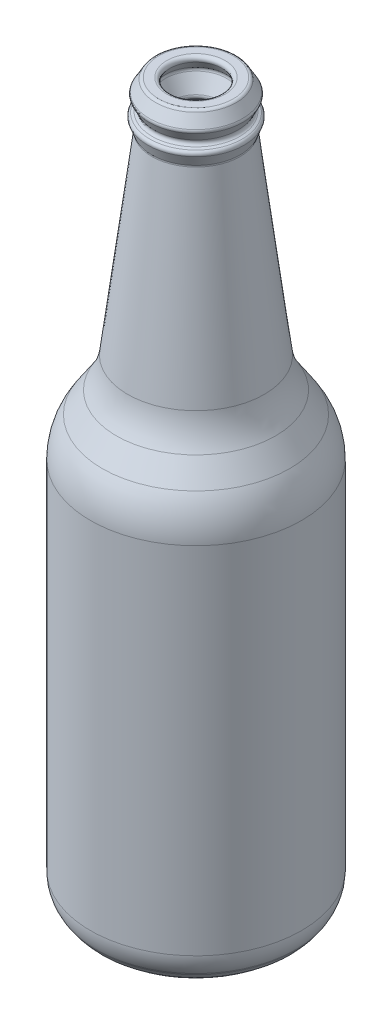
ISO-10303-21;
HEADER;
FILE_DESCRIPTION(('STEP AP214'),'2;1');
FILE_NAME('part.step','',(''),(''),'','','');
FILE_SCHEMA(('AUTOMOTIVE_DESIGN { 1 0 10303 214 1 1 1 1 }'));
ENDSEC;
DATA;
#1=APPLICATION_CONTEXT('core data for automotive mechanical design processes');
#2=APPLICATION_PROTOCOL_DEFINITION('international standard','automotive_design',2000,#1);
#3=PRODUCT_CONTEXT('',#1,'mechanical');
#4=PRODUCT('Part','Part','',(#3));
#5=PRODUCT_RELATED_PRODUCT_CATEGORY('part','',(#4));
#6=PRODUCT_DEFINITION_FORMATION('','',#4);
#7=PRODUCT_DEFINITION_CONTEXT('part definition',#1,'design');
#8=PRODUCT_DEFINITION('design','',#6,#7);
#9=PRODUCT_DEFINITION_SHAPE('','',#8);
#10=(LENGTH_UNIT() NAMED_UNIT(*) SI_UNIT(.MILLI.,.METRE.));
#11=(NAMED_UNIT(*) PLANE_ANGLE_UNIT() SI_UNIT($,.RADIAN.));
#12=(NAMED_UNIT(*) SI_UNIT($,.STERADIAN.) SOLID_ANGLE_UNIT());
#13=UNCERTAINTY_MEASURE_WITH_UNIT(LENGTH_MEASURE(1.E-05),#10,'distance_accuracy_value','');
#14=(GEOMETRIC_REPRESENTATION_CONTEXT(3) GLOBAL_UNCERTAINTY_ASSIGNED_CONTEXT((#13)) GLOBAL_UNIT_ASSIGNED_CONTEXT((#10,
#11,#12)) REPRESENTATION_CONTEXT('',''));
#15=CARTESIAN_POINT('',(0.,0.,0.));
#16=DIRECTION('',(0.,0.,1.));
#17=DIRECTION('',(1.,0.,0.));
#18=AXIS2_PLACEMENT_3D('',#15,#16,#17);
#19=CARTESIAN_POINT('',(0.,127.791737032349,0.));
#20=DIRECTION('',(0.,-1.,0.));
#21=DIRECTION('',(1.,0.,0.));
#22=AXIS2_PLACEMENT_3D('',#19,#20,#21);
#23=PLANE('',#22);
#24=CARTESIAN_POINT('',(0.,127.791737032349,0.));
#25=DIRECTION('',(0.,-1.,0.));
#26=DIRECTION('',(1.,0.,0.));
#27=AXIS2_PLACEMENT_3D('',#24,#25,#26);
#28=CIRCLE('',#27,8.2793986318879);
#29=CARTESIAN_POINT('',(8.2793986318879,127.791737032349,0.));
#30=VERTEX_POINT('',#29);
#31=EDGE_CURVE('E10',#30,#30,#28,.T.);
#32=ORIENTED_EDGE('',*,*,#31,.T.);
#33=EDGE_LOOP('',(#32));
#34=FACE_BOUND('',#33,.T.);
#35=CARTESIAN_POINT('',(0.,127.791737032349,0.));
#36=DIRECTION('',(0.,-1.,0.));
#37=DIRECTION('',(1.,0.,0.));
#38=AXIS2_PLACEMENT_3D('',#35,#36,#37);
#39=CIRCLE('',#38,10.5942455296789);
#40=CARTESIAN_POINT('',(10.5942455296789,127.791737032349,0.));
#41=VERTEX_POINT('',#40);
#42=EDGE_CURVE('E58',#41,#41,#39,.F.);
#43=ORIENTED_EDGE('',*,*,#42,.T.);
#44=EDGE_LOOP('',(#43));
#45=FACE_BOUND('',#44,.T.);
#46=ADVANCED_FACE('F32',(#34,#45),#23,.F.);
#47=CARTESIAN_POINT('',(0.,123.791737032349,0.));
#48=DIRECTION('',(0.,-1.,0.));
#49=DIRECTION('',(1.,0.,0.));
#50=AXIS2_PLACEMENT_3D('',#47,#48,#49);
#51=CONICAL_SURFACE('',#50,13.5,0.527659265166952);
#52=CARTESIAN_POINT('',(0.,124.266053201565,0.));
#53=DIRECTION('',(0.,1.,0.));
#54=DIRECTION('',(-1.,0.,0.));
#55=AXIS2_PLACEMENT_3D('',#52,#53,#54);
#56=CIRCLE('',#55,13.2235794424648);
#57=CARTESIAN_POINT('',(-13.2235794424648,124.266053201565,0.));
#58=VERTEX_POINT('',#57);
#59=EDGE_CURVE('E61',#58,#58,#56,.T.);
#60=ORIENTED_EDGE('',*,*,#59,.T.);
#61=EDGE_LOOP('',(#60));
#62=FACE_BOUND('',#61,.T.);
#63=CARTESIAN_POINT('',(0.,127.295249387916,0.));
#64=DIRECTION('',(0.,1.,0.));
#65=DIRECTION('',(-1.,0.,0.));
#66=AXIS2_PLACEMENT_3D('',#63,#64,#65);
#67=CIRCLE('',#66,11.4582335549382);
#68=CARTESIAN_POINT('',(-11.4582335549382,127.295249387916,0.));
#69=VERTEX_POINT('',#68);
#70=EDGE_CURVE('E64',#69,#69,#67,.F.);
#71=ORIENTED_EDGE('',*,*,#70,.T.);
#72=EDGE_LOOP('',(#71));
#73=FACE_BOUND('',#72,.T.);
#74=ADVANCED_FACE('F149',(#62,#73),#51,.T.);
#75=CARTESIAN_POINT('',(0.,119.916737032349,0.));
#76=DIRECTION('',(0.,1.,0.));
#77=DIRECTION('',(-1.,0.,0.));
#78=AXIS2_PLACEMENT_3D('',#75,#76,#77);
#79=CONICAL_SURFACE('',#78,11.5,0.476467419473708);
#80=CARTESIAN_POINT('',(0.,120.854324107116,0.));
#81=DIRECTION('',(0.,1.,0.));
#82=DIRECTION('',(-1.,0.,0.));
#83=AXIS2_PLACEMENT_3D('',#80,#81,#82);
#84=CIRCLE('',#83,11.9839159095576);
#85=CARTESIAN_POINT('',(-11.9839159095576,120.854324107116,0.));
#86=VERTEX_POINT('',#85);
#87=EDGE_CURVE('E67',#86,#86,#84,.T.);
#88=ORIENTED_EDGE('',*,*,#87,.T.);
#89=EDGE_LOOP('',(#88));
#90=FACE_BOUND('',#89,.T.);
#91=CARTESIAN_POINT('',(0.,123.303897926228,0.));
#92=DIRECTION('',(0.,-1.,0.));
#93=DIRECTION('',(1.,0.,0.));
#94=AXIS2_PLACEMENT_3D('',#91,#92,#93);
#95=CIRCLE('',#94,13.2482120742605);
#96=CARTESIAN_POINT('',(13.2482120742605,123.303897926228,0.));
#97=VERTEX_POINT('',#96);
#98=EDGE_CURVE('E70',#97,#97,#95,.T.);
#99=ORIENTED_EDGE('',*,*,#98,.T.);
#100=EDGE_LOOP('',(#99));
#101=FACE_BOUND('',#100,.T.);
#102=ADVANCED_FACE('F154',(#90,#101),#79,.T.);
#103=CARTESIAN_POINT('',(0.,118.791737032349,0.));
#104=DIRECTION('',(0.,-1.,0.));
#105=DIRECTION('',(1.,0.,0.));
#106=AXIS2_PLACEMENT_3D('',#103,#104,#105);
#107=CONICAL_SURFACE('',#106,14.,1.14794240066196);
#108=CARTESIAN_POINT('',(0.,119.176612206573,0.));
#109=DIRECTION('',(0.,1.,0.));
#110=DIRECTION('',(-1.,0.,0.));
#111=AXIS2_PLACEMENT_3D('',#108,#109,#110);
#112=CIRCLE('',#111,13.1447218350575);
#113=CARTESIAN_POINT('',(-13.1447218350575,119.176612206573,0.));
#114=VERTEX_POINT('',#113);
#115=EDGE_CURVE('E73',#114,#114,#112,.T.);
#116=ORIENTED_EDGE('',*,*,#115,.T.);
#117=EDGE_LOOP('',(#116));
#118=FACE_BOUND('',#117,.T.);
#119=CARTESIAN_POINT('',(0.,119.483759682171,0.));
#120=DIRECTION('',(0.,-1.,0.));
#121=DIRECTION('',(1.,0.,0.));
#122=AXIS2_PLACEMENT_3D('',#119,#120,#121);
#123=CIRCLE('',#122,12.4621718892836);
#124=CARTESIAN_POINT('',(12.4621718892836,119.483759682171,0.));
#125=VERTEX_POINT('',#124);
#126=EDGE_CURVE('E76',#125,#125,#123,.T.);
#127=ORIENTED_EDGE('',*,*,#126,.T.);
#128=EDGE_LOOP('',(#127));
#129=FACE_BOUND('',#128,.T.);
#130=ADVANCED_FACE('F247',(#118,#129),#107,.T.);
#131=CARTESIAN_POINT('',(0.,114.791737032349,0.));
#132=DIRECTION('',(0.,1.,0.));
#133=DIRECTION('',(-1.,0.,0.));
#134=AXIS2_PLACEMENT_3D('',#131,#132,#133);
#135=CONICAL_SURFACE('',#134,12.5,0.358770670270572);
#136=CARTESIAN_POINT('',(0.,115.022423974682,0.));
#137=DIRECTION('',(0.,1.,0.));
#138=DIRECTION('',(-1.,0.,0.));
#139=AXIS2_PLACEMENT_3D('',#136,#137,#138);
#140=CIRCLE('',#139,12.5865076033751);
#141=CARTESIAN_POINT('',(-12.5865076033751,115.022423974682,0.));
#142=VERTEX_POINT('',#141);
#143=EDGE_CURVE('E82',#142,#142,#140,.T.);
#144=ORIENTED_EDGE('',*,*,#143,.T.);
#145=EDGE_LOOP('',(#144));
#146=FACE_BOUND('',#145,.T.);
#147=CARTESIAN_POINT('',(0.,117.913567259809,0.));
#148=DIRECTION('',(0.,-1.,0.));
#149=DIRECTION('',(1.,0.,0.));
#150=AXIS2_PLACEMENT_3D('',#147,#148,#149);
#151=CIRCLE('',#150,13.6706863352978);
#152=CARTESIAN_POINT('',(13.6706863352978,117.913567259809,0.));
#153=VERTEX_POINT('',#152);
#154=EDGE_CURVE('E85',#153,#153,#151,.T.);
#155=ORIENTED_EDGE('',*,*,#154,.T.);
#156=EDGE_LOOP('',(#155));
#157=FACE_BOUND('',#156,.T.);
#158=ADVANCED_FACE('F243',(#146,#157),#135,.T.);
#159=CARTESIAN_POINT('',(0.,54.7917370323486,0.));
#160=DIRECTION('',(0.,-1.,0.));
#161=DIRECTION('',(1.,0.,0.));
#162=AXIS2_PLACEMENT_3D('',#159,#160,#161);
#163=CONICAL_SURFACE('',#162,20.,0.124354994546761);
#164=CARTESIAN_POINT('',(0.,114.547265798505,0.));
#165=DIRECTION('',(0.,-1.,0.));
#166=DIRECTION('',(1.,0.,0.));
#167=AXIS2_PLACEMENT_3D('',#164,#165,#166);
#168=CIRCLE('',#167,12.5305589042305);
#169=CARTESIAN_POINT('',(12.5305589042305,114.547265798505,0.));
#170=VERTEX_POINT('',#169);
#171=EDGE_CURVE('E79',#170,#170,#168,.T.);
#172=ORIENTED_EDGE('',*,*,#171,.T.);
#173=EDGE_LOOP('',(#172));
#174=FACE_BOUND('',#173,.T.);
#175=CARTESIAN_POINT('',(0.,59.4766376618203,0.));
#176=DIRECTION('',(0.,-1.,0.));
#177=DIRECTION('',(1.,0.,0.));
#178=AXIS2_PLACEMENT_3D('',#175,#176,#177);
#179=CIRCLE('',#178,19.4143874213161);
#180=CARTESIAN_POINT('',(19.4143874213161,59.4766376618203,0.));
#181=VERTEX_POINT('',#180);
#182=EDGE_CURVE('E100',#181,#181,#179,.F.);
#183=ORIENTED_EDGE('',*,*,#182,.T.);
#184=EDGE_LOOP('',(#183));
#185=FACE_BOUND('',#184,.T.);
#186=ADVANCED_FACE('F239',(#174,#185),#163,.T.);
#187=CARTESIAN_POINT('',(0.,39.7917370323486,0.));
#188=DIRECTION('',(0.,-1.,0.));
#189=DIRECTION('',(1.,0.,0.));
#190=AXIS2_PLACEMENT_3D('',#187,#188,#189);
#191=CONICAL_SURFACE('',#190,30.,0.588002603547568);
#192=CARTESIAN_POINT('',(0.,44.8302282022133,0.));
#193=DIRECTION('',(0.,1.,0.));
#194=DIRECTION('',(-1.,0.,0.));
#195=AXIS2_PLACEMENT_3D('',#192,#193,#194);
#196=CIRCLE('',#195,26.6410058867569);
#197=CARTESIAN_POINT('',(-26.6410058867569,44.8302282022133,0.));
#198=VERTEX_POINT('',#197);
#199=EDGE_CURVE('E106',#198,#198,#196,.T.);
#200=ORIENTED_EDGE('',*,*,#199,.T.);
#201=EDGE_LOOP('',(#200));
#202=FACE_BOUND('',#201,.T.);
#203=CARTESIAN_POINT('',(0.,50.8633284290998,0.));
#204=DIRECTION('',(0.,-1.,0.));
#205=DIRECTION('',(1.,0.,0.));
#206=AXIS2_PLACEMENT_3D('',#203,#204,#205);
#207=CIRCLE('',#206,22.6189390688325);
#208=CARTESIAN_POINT('',(22.6189390688325,50.8633284290998,0.));
#209=VERTEX_POINT('',#208);
#210=EDGE_CURVE('E109',#209,#209,#207,.T.);
#211=ORIENTED_EDGE('',*,*,#210,.T.);
#212=EDGE_LOOP('',(#211));
#213=FACE_BOUND('',#212,.T.);
#214=ADVANCED_FACE('F235',(#202,#213),#191,.T.);
#215=CARTESIAN_POINT('',(0.,127.791737032349,0.));
#216=DIRECTION('',(0.,1.,0.));
#217=DIRECTION('',(-1.,0.,0.));
#218=AXIS2_PLACEMENT_3D('',#215,#216,#217);
#219=CYLINDRICAL_SURFACE('',#218,30.);
#220=CARTESIAN_POINT('',(0.,-67.1805065903314,0.));
#221=DIRECTION('',(0.,-1.,0.));
#222=DIRECTION('',(1.,0.,0.));
#223=AXIS2_PLACEMENT_3D('',#220,#221,#222);
#224=CIRCLE('',#223,30.);
#225=CARTESIAN_POINT('',(30.,-67.1805065903314,0.));
#226=VERTEX_POINT('',#225);
#227=EDGE_CURVE('E88',#226,#226,#224,.F.);
#228=ORIENTED_EDGE('',*,*,#227,.T.);
#229=EDGE_LOOP('',(#228));
#230=FACE_BOUND('',#229,.T.);
#231=CARTESIAN_POINT('',(0.,33.7362242777087,0.));
#232=DIRECTION('',(0.,-1.,0.));
#233=DIRECTION('',(1.,0.,0.));
#234=AXIS2_PLACEMENT_3D('',#231,#232,#233);
#235=CIRCLE('',#234,30.);
#236=CARTESIAN_POINT('',(30.,33.7362242777087,0.));
#237=VERTEX_POINT('',#236);
#238=EDGE_CURVE('E103',#237,#237,#235,.T.);
#239=ORIENTED_EDGE('',*,*,#238,.T.);
#240=EDGE_LOOP('',(#239));
#241=FACE_BOUND('',#240,.T.);
#242=ADVANCED_FACE('F227',(#230,#241),#219,.T.);
#243=CARTESIAN_POINT('',(0.,-77.7082629676514,0.));
#244=DIRECTION('',(0.,1.,0.));
#245=DIRECTION('',(-1.,0.,0.));
#246=AXIS2_PLACEMENT_3D('',#243,#244,#245);
#247=CONICAL_SURFACE('',#246,25.,0.58800260354757);
#248=CARTESIAN_POINT('',(0.,-73.2552649299037,0.));
#249=DIRECTION('',(0.,-1.,0.));
#250=DIRECTION('',(1.,0.,0.));
#251=AXIS2_PLACEMENT_3D('',#248,#249,#250);
#252=CIRCLE('',#251,27.9686653584985);
#253=CARTESIAN_POINT('',(27.9686653584985,-73.2552649299037,0.));
#254=VERTEX_POINT('',#253);
#255=EDGE_CURVE('E94',#254,#254,#252,.F.);
#256=ORIENTED_EDGE('',*,*,#255,.T.);
#257=EDGE_LOOP('',(#256));
#258=FACE_BOUND('',#257,.T.);
#259=CARTESIAN_POINT('',(0.,-72.7275085525838,0.));
#260=DIRECTION('',(0.,-1.,0.));
#261=DIRECTION('',(1.,0.,0.));
#262=AXIS2_PLACEMENT_3D('',#259,#260,#261);
#263=CIRCLE('',#262,28.3205029433785);
#264=CARTESIAN_POINT('',(28.3205029433785,-72.7275085525838,0.));
#265=VERTEX_POINT('',#264);
#266=EDGE_CURVE('E97',#265,#265,#263,.T.);
#267=ORIENTED_EDGE('',*,*,#266,.T.);
#268=EDGE_LOOP('',(#267));
#269=FACE_BOUND('',#268,.T.);
#270=ADVANCED_FACE('F221',(#258,#269),#247,.T.);
#271=CARTESIAN_POINT('',(25.,-77.7082629676514,0.));
#272=DIRECTION('',(0.,1.,0.));
#273=DIRECTION('',(-1.,0.,0.));
#274=AXIS2_PLACEMENT_3D('',#271,#272,#273);
#275=PLANE('',#274);
#276=CARTESIAN_POINT('',(0.,-77.7082629676514,0.));
#277=DIRECTION('',(0.,1.,0.));
#278=DIRECTION('',(-1.,0.,0.));
#279=AXIS2_PLACEMENT_3D('',#276,#277,#278);
#280=CIRCLE('',#279,19.6481624151201);
#281=CARTESIAN_POINT('',(-19.6481624151201,-77.7082629676514,0.));
#282=VERTEX_POINT('',#281);
#283=EDGE_CURVE('E91',#282,#282,#280,.F.);
#284=ORIENTED_EDGE('',*,*,#283,.T.);
#285=EDGE_LOOP('',(#284));
#286=FACE_BOUND('',#285,.T.);
#287=ADVANCED_FACE('F216',(#286),#275,.F.);
#288=CARTESIAN_POINT('',(0.,121.777687610081,0.));
#289=DIRECTION('',(0.,-1.,0.));
#290=DIRECTION('',(1.,0.,0.));
#291=AXIS2_PLACEMENT_3D('',#288,#289,#290);
#292=CONICAL_SURFACE('',#291,10.044047898963,0.527659265166952);
#293=CARTESIAN_POINT('',(0.,124.149268456165,0.));
#294=DIRECTION('',(0.,-1.,0.));
#295=DIRECTION('',(1.,0.,0.));
#296=AXIS2_PLACEMENT_3D('',#293,#294,#295);
#297=CIRCLE('',#296,8.66194511128713);
#298=CARTESIAN_POINT('',(8.66194511128713,124.149268456165,0.));
#299=VERTEX_POINT('',#298);
#300=EDGE_CURVE('E39',#299,#299,#297,.T.);
#301=ORIENTED_EDGE('',*,*,#300,.T.);
#302=EDGE_LOOP('',(#301));
#303=FACE_BOUND('',#302,.T.);
#304=CARTESIAN_POINT('',(0.,126.288224676782,0.));
#305=DIRECTION('',(0.,-1.,0.));
#306=DIRECTION('',(1.,0.,0.));
#307=AXIS2_PLACEMENT_3D('',#304,#305,#306);
#308=CIRCLE('',#307,7.41541060662864);
#309=CARTESIAN_POINT('',(7.41541060662864,126.288224676782,0.));
#310=VERTEX_POINT('',#309);
#311=EDGE_CURVE('E43',#310,#310,#308,.F.);
#312=ORIENTED_EDGE('',*,*,#311,.T.);
#313=EDGE_LOOP('',(#312));
#314=FACE_BOUND('',#313,.T.);
#315=ADVANCED_FACE('F145',(#303,#314),#292,.F.);
#316=CARTESIAN_POINT('',(0.,121.75130871143,0.));
#317=DIRECTION('',(0.,1.,0.));
#318=DIRECTION('',(-1.,0.,0.));
#319=AXIS2_PLACEMENT_3D('',#316,#317,#318);
#320=CONICAL_SURFACE('',#319,7.94551737178056,0.476467419473708);
#321=CARTESIAN_POINT('',(0.,118.938547487126,0.));
#322=DIRECTION('',(0.,-1.,0.));
#323=DIRECTION('',(1.,0.,0.));
#324=AXIS2_PLACEMENT_3D('',#321,#322,#323);
#325=CIRCLE('',#324,6.49376964310794);
#326=CARTESIAN_POINT('',(6.49376964310794,118.938547487126,0.));
#327=VERTEX_POINT('',#326);
#328=EDGE_CURVE('E47',#327,#327,#325,.T.);
#329=ORIENTED_EDGE('',*,*,#328,.T.);
#330=EDGE_LOOP('',(#329));
#331=FACE_BOUND('',#330,.T.);
#332=CARTESIAN_POINT('',(0.,123.187113180828,0.));
#333=DIRECTION('',(0.,1.,0.));
#334=DIRECTION('',(-1.,0.,0.));
#335=AXIS2_PLACEMENT_3D('',#332,#333,#334);
#336=CIRCLE('',#335,8.68657774308274);
#337=CARTESIAN_POINT('',(-8.68657774308274,123.187113180828,0.));
#338=VERTEX_POINT('',#337);
#339=EDGE_CURVE('E52',#338,#338,#336,.T.);
#340=ORIENTED_EDGE('',*,*,#339,.T.);
#341=EDGE_LOOP('',(#340));
#342=FACE_BOUND('',#341,.T.);
#343=ADVANCED_FACE('F136',(#331,#342),#320,.F.);
#344=CARTESIAN_POINT('',(0.,115.144051011648,0.));
#345=DIRECTION('',(0.,-1.,0.));
#346=DIRECTION('',(1.,0.,0.));
#347=AXIS2_PLACEMENT_3D('',#344,#345,#346);
#348=CONICAL_SURFACE('',#347,12.3585412906848,1.14794240066196);
#349=CARTESIAN_POINT('',(0.,117.567983062181,0.));
#350=DIRECTION('',(0.,1.,0.));
#351=DIRECTION('',(-1.,0.,0.));
#352=AXIS2_PLACEMENT_3D('',#349,#350,#351);
#353=CIRCLE('',#352,6.972025622834);
#354=CARTESIAN_POINT('',(-6.972025622834,117.567983062181,0.));
#355=VERTEX_POINT('',#354);
#356=EDGE_CURVE('E55',#355,#355,#353,.T.);
#357=ORIENTED_EDGE('',*,*,#356,.T.);
#358=EDGE_LOOP('',(#357));
#359=FACE_BOUND('',#358,.T.);
#360=CARTESIAN_POINT('',(0.,116.683551708545,0.));
#361=DIRECTION('',(0.,1.,0.));
#362=DIRECTION('',(-1.,0.,0.));
#363=AXIS2_PLACEMENT_3D('',#360,#361,#362);
#364=CIRCLE('',#363,8.93742863091478);
#365=CARTESIAN_POINT('',(-8.93742863091478,116.683551708545,0.));
#366=VERTEX_POINT('',#365);
#367=EDGE_CURVE('E112',#366,#366,#364,.T.);
#368=ORIENTED_EDGE('',*,*,#367,.F.);
#369=EDGE_LOOP('',(#368));
#370=FACE_BOUND('',#369,.T.);
#371=ADVANCED_FACE('F134',(#359,#370),#348,.F.);
#372=CARTESIAN_POINT('',(0.,116.196230798702,0.));
#373=DIRECTION('',(0.,1.,0.));
#374=DIRECTION('',(-1.,0.,0.));
#375=AXIS2_PLACEMENT_3D('',#372,#373,#374);
#376=CONICAL_SURFACE('',#375,8.75468328972384,0.358770670270572);
#377=ORIENTED_EDGE('',*,*,#367,.T.);
#378=EDGE_LOOP('',(#377));
#379=FACE_BOUND('',#378,.T.);
#380=CARTESIAN_POINT('',(0.,115.273483029368,0.));
#381=DIRECTION('',(0.,1.,0.));
#382=DIRECTION('',(-1.,0.,0.));
#383=AXIS2_PLACEMENT_3D('',#380,#381,#382);
#384=CIRCLE('',#383,8.40865287622337);
#385=CARTESIAN_POINT('',(-8.40865287622337,115.273483029368,0.));
#386=VERTEX_POINT('',#385);
#387=EDGE_CURVE('E125',#386,#386,#384,.T.);
#388=ORIENTED_EDGE('',*,*,#387,.F.);
#389=EDGE_LOOP('',(#388));
#390=FACE_BOUND('',#389,.T.);
#391=ADVANCED_FACE('F131',(#379,#390),#376,.F.);
#392=CARTESIAN_POINT('',(0.,54.2955980939918,0.));
#393=DIRECTION('',(0.,-1.,0.));
#394=DIRECTION('',(1.,0.,0.));
#395=AXIS2_PLACEMENT_3D('',#392,#393,#394);
#396=CONICAL_SURFACE('',#395,16.0308884931453,0.124354994546761);
#397=ORIENTED_EDGE('',*,*,#387,.T.);
#398=EDGE_LOOP('',(#397));
#399=FACE_BOUND('',#398,.T.);
#400=CARTESIAN_POINT('',(0.,53.3586179680975,0.));
#401=DIRECTION('',(0.,1.,0.));
#402=DIRECTION('',(-1.,0.,0.));
#403=AXIS2_PLACEMENT_3D('',#400,#401,#402);
#404=CIRCLE('',#403,16.1480110088821);
#405=CARTESIAN_POINT('',(-16.1480110088821,53.3586179680975,0.));
#406=VERTEX_POINT('',#405);
#407=EDGE_CURVE('E122',#406,#406,#404,.T.);
#408=ORIENTED_EDGE('',*,*,#407,.F.);
#409=EDGE_LOOP('',(#408));
#410=FACE_BOUND('',#409,.T.);
#411=ADVANCED_FACE('F143',(#399,#410),#396,.F.);
#412=CARTESIAN_POINT('',(0.,37.5729362474477,0.));
#413=DIRECTION('',(0.,-1.,0.));
#414=DIRECTION('',(1.,0.,0.));
#415=AXIS2_PLACEMENT_3D('',#412,#413,#414);
#416=CONICAL_SURFACE('',#415,26.6717988226487,0.588002603547568);
#417=ORIENTED_EDGE('',*,*,#407,.T.);
#418=EDGE_LOOP('',(#417));
#419=FACE_BOUND('',#418,.T.);
#420=CARTESIAN_POINT('',(0.,38.5806344814206,0.));
#421=DIRECTION('',(0.,-1.,0.));
#422=DIRECTION('',(1.,0.,0.));
#423=AXIS2_PLACEMENT_3D('',#420,#421,#422);
#424=CIRCLE('',#423,26.);
#425=CARTESIAN_POINT('',(26.,38.5806344814206,0.));
#426=VERTEX_POINT('',#425);
#427=EDGE_CURVE('E119',#426,#426,#424,.F.);
#428=ORIENTED_EDGE('',*,*,#427,.F.);
#429=EDGE_LOOP('',(#428));
#430=FACE_BOUND('',#429,.T.);
#431=ADVANCED_FACE('F394',(#419,#430),#416,.F.);
#432=CARTESIAN_POINT('',(0.,127.791737032349,0.));
#433=DIRECTION('',(0.,1.,0.));
#434=DIRECTION('',(-1.,0.,0.));
#435=AXIS2_PLACEMENT_3D('',#432,#433,#434);
#436=CYLINDRICAL_SURFACE('',#435,26.);
#437=ORIENTED_EDGE('',*,*,#427,.T.);
#438=EDGE_LOOP('',(#437));
#439=FACE_BOUND('',#438,.T.);
#440=CARTESIAN_POINT('',(0.,-68.9971604167234,0.));
#441=DIRECTION('',(0.,1.,0.));
#442=DIRECTION('',(-1.,0.,0.));
#443=AXIS2_PLACEMENT_3D('',#440,#441,#442);
#444=CIRCLE('',#443,26.);
#445=CARTESIAN_POINT('',(-26.,-68.9971604167234,0.));
#446=VERTEX_POINT('',#445);
#447=EDGE_CURVE('E116',#446,#446,#444,.T.);
#448=ORIENTED_EDGE('',*,*,#447,.F.);
#449=EDGE_LOOP('',(#448));
#450=FACE_BOUND('',#449,.T.);
#451=ADVANCED_FACE('F403',(#439,#450),#436,.F.);
#452=CARTESIAN_POINT('',(0.,-75.4894621827504,0.));
#453=DIRECTION('',(0.,1.,0.));
#454=DIRECTION('',(-1.,0.,0.));
#455=AXIS2_PLACEMENT_3D('',#452,#453,#454);
#456=CONICAL_SURFACE('',#455,21.6717988226487,0.58800260354757);
#457=ORIENTED_EDGE('',*,*,#447,.T.);
#458=EDGE_LOOP('',(#457));
#459=FACE_BOUND('',#458,.T.);
#460=CARTESIAN_POINT('',(0.,-73.7082629676514,0.));
#461=DIRECTION('',(0.,1.,0.));
#462=DIRECTION('',(-1.,0.,0.));
#463=AXIS2_PLACEMENT_3D('',#460,#461,#462);
#464=CIRCLE('',#463,22.859264966048);
#465=CARTESIAN_POINT('',(-22.859264966048,-73.7082629676514,0.));
#466=VERTEX_POINT('',#465);
#467=EDGE_CURVE('E113',#466,#466,#464,.T.);
#468=ORIENTED_EDGE('',*,*,#467,.F.);
#469=EDGE_LOOP('',(#468));
#470=FACE_BOUND('',#469,.T.);
#471=ADVANCED_FACE('F412',(#459,#470),#456,.F.);
#472=CARTESIAN_POINT('',(25.,-73.7082629676514,0.));
#473=DIRECTION('',(0.,1.,0.));
#474=DIRECTION('',(-1.,0.,0.));
#475=AXIS2_PLACEMENT_3D('',#472,#473,#474);
#476=PLANE('',#475);
#477=ORIENTED_EDGE('',*,*,#467,.T.);
#478=EDGE_LOOP('',(#477));
#479=FACE_BOUND('',#478,.T.);
#480=ADVANCED_FACE('F164',(#479),#476,.T.);
#481=CARTESIAN_POINT('',(0.,33.7362242777087,0.));
#482=DIRECTION('',(0.,-1.,0.));
#483=DIRECTION('',(1.,0.,0.));
#484=AXIS2_PLACEMENT_3D('',#481,#482,#483);
#485=DEGENERATE_TOROIDAL_SURFACE('',#484,10.,20.,.T.);
#486=ORIENTED_EDGE('',*,*,#238,.F.);
#487=EDGE_LOOP('',(#486));
#488=FACE_BOUND('',#487,.T.);
#489=ORIENTED_EDGE('',*,*,#199,.F.);
#490=EDGE_LOOP('',(#489));
#491=FACE_BOUND('',#490,.T.);
#492=ADVANCED_FACE('F160',(#488,#491),#485,.T.);
#493=CARTESIAN_POINT('',(0.,61.9573323536044,0.));
#494=DIRECTION('',(0.,1.,0.));
#495=DIRECTION('',(-1.,0.,0.));
#496=AXIS2_PLACEMENT_3D('',#493,#494,#495);
#497=TOROIDAL_SURFACE('',#496,39.2599449555894,20.);
#498=ORIENTED_EDGE('',*,*,#210,.F.);
#499=EDGE_LOOP('',(#498));
#500=FACE_BOUND('',#499,.T.);
#501=ORIENTED_EDGE('',*,*,#182,.F.);
#502=EDGE_LOOP('',(#501));
#503=FACE_BOUND('',#502,.T.);
#504=ADVANCED_FACE('F163',(#500,#503),#497,.F.);
#505=CARTESIAN_POINT('',(0.,-67.7082629676514,0.));
#506=DIRECTION('',(0.,1.,0.));
#507=DIRECTION('',(-1.,0.,0.));
#508=AXIS2_PLACEMENT_3D('',#505,#506,#507);
#509=TOROIDAL_SURFACE('',#508,19.6481624151201,10.);
#510=ORIENTED_EDGE('',*,*,#283,.F.);
#511=EDGE_LOOP('',(#510));
#512=FACE_BOUND('',#511,.T.);
#513=ORIENTED_EDGE('',*,*,#255,.F.);
#514=EDGE_LOOP('',(#513));
#515=FACE_BOUND('',#514,.T.);
#516=ADVANCED_FACE('F168',(#512,#515),#509,.T.);
#517=CARTESIAN_POINT('',(0.,-67.1805065903314,0.));
#518=DIRECTION('',(0.,-1.,0.));
#519=DIRECTION('',(1.,0.,0.));
#520=AXIS2_PLACEMENT_3D('',#517,#518,#519);
#521=TOROIDAL_SURFACE('',#520,20.,10.);
#522=ORIENTED_EDGE('',*,*,#266,.F.);
#523=EDGE_LOOP('',(#522));
#524=FACE_BOUND('',#523,.T.);
#525=ORIENTED_EDGE('',*,*,#227,.F.);
#526=EDGE_LOOP('',(#525));
#527=FACE_BOUND('',#526,.T.);
#528=ADVANCED_FACE('F172',(#524,#527),#521,.T.);
#529=CARTESIAN_POINT('',(0.,114.671300533094,0.));
#530=DIRECTION('',(0.,1.,0.));
#531=DIRECTION('',(-1.,0.,0.));
#532=AXIS2_PLACEMENT_3D('',#529,#530,#531);
#533=TOROIDAL_SURFACE('',#532,13.5228367809442,1.);
#534=ORIENTED_EDGE('',*,*,#171,.F.);
#535=EDGE_LOOP('',(#534));
#536=FACE_BOUND('',#535,.T.);
#537=ORIENTED_EDGE('',*,*,#143,.F.);
#538=EDGE_LOOP('',(#537));
#539=FACE_BOUND('',#538,.T.);
#540=ADVANCED_FACE('F176',(#536,#539),#533,.F.);
#541=CARTESIAN_POINT('',(0.,118.264690701398,0.));
#542=DIRECTION('',(0.,-1.,0.));
#543=DIRECTION('',(1.,0.,0.));
#544=AXIS2_PLACEMENT_3D('',#541,#542,#543);
#545=TOROIDAL_SURFACE('',#544,12.7343571577287,1.);
#546=ORIENTED_EDGE('',*,*,#154,.F.);
#547=EDGE_LOOP('',(#546));
#548=FACE_BOUND('',#547,.T.);
#549=ORIENTED_EDGE('',*,*,#115,.F.);
#550=EDGE_LOOP('',(#549));
#551=FACE_BOUND('',#550,.T.);
#552=ADVANCED_FACE('F180',(#548,#551),#545,.T.);
#553=CARTESIAN_POINT('',(0.,120.395681187346,0.));
#554=DIRECTION('',(0.,1.,0.));
#555=DIRECTION('',(-1.,0.,0.));
#556=AXIS2_PLACEMENT_3D('',#553,#554,#555);
#557=TOROIDAL_SURFACE('',#556,12.8725365666124,1.);
#558=ORIENTED_EDGE('',*,*,#126,.F.);
#559=EDGE_LOOP('',(#558));
#560=FACE_BOUND('',#559,.T.);
#561=ORIENTED_EDGE('',*,*,#87,.F.);
#562=EDGE_LOOP('',(#561));
#563=FACE_BOUND('',#562,.T.);
#564=ADVANCED_FACE('F184',(#560,#563),#557,.F.);
#565=CARTESIAN_POINT('',(0.,123.762540845998,0.));
#566=DIRECTION('',(0.,-1.,0.));
#567=DIRECTION('',(1.,0.,0.));
#568=AXIS2_PLACEMENT_3D('',#565,#566,#567);
#569=TOROIDAL_SURFACE('',#568,12.3595914172056,1.);
#570=ORIENTED_EDGE('',*,*,#98,.F.);
#571=EDGE_LOOP('',(#570));
#572=FACE_BOUND('',#571,.T.);
#573=ORIENTED_EDGE('',*,*,#59,.F.);
#574=EDGE_LOOP('',(#573));
#575=FACE_BOUND('',#574,.T.);
#576=ADVANCED_FACE('F188',(#572,#575),#569,.T.);
#577=CARTESIAN_POINT('',(0.,126.791737032349,0.));
#578=DIRECTION('',(0.,-1.,0.));
#579=DIRECTION('',(1.,0.,0.));
#580=AXIS2_PLACEMENT_3D('',#577,#578,#579);
#581=TOROIDAL_SURFACE('',#580,10.5942455296789,1.);
#582=ORIENTED_EDGE('',*,*,#70,.F.);
#583=EDGE_LOOP('',(#582));
#584=FACE_BOUND('',#583,.T.);
#585=ORIENTED_EDGE('',*,*,#42,.F.);
#586=EDGE_LOOP('',(#585));
#587=FACE_BOUND('',#586,.T.);
#588=ADVANCED_FACE('F192',(#584,#587),#581,.T.);
#589=CARTESIAN_POINT('',(0.,118.479904567356,0.));
#590=DIRECTION('',(0.,-1.,0.));
#591=DIRECTION('',(1.,0.,0.));
#592=AXIS2_PLACEMENT_3D('',#589,#590,#591);
#593=TOROIDAL_SURFACE('',#592,7.3823903001628,1.);
#594=ORIENTED_EDGE('',*,*,#328,.F.);
#595=EDGE_LOOP('',(#594));
#596=FACE_BOUND('',#595,.T.);
#597=ORIENTED_EDGE('',*,*,#356,.F.);
#598=EDGE_LOOP('',(#597));
#599=FACE_BOUND('',#598,.T.);
#600=ADVANCED_FACE('F196',(#596,#599),#593,.T.);
#601=CARTESIAN_POINT('',(0.,123.645756100598,0.));
#602=DIRECTION('',(0.,1.,0.));
#603=DIRECTION('',(-1.,0.,0.));
#604=AXIS2_PLACEMENT_3D('',#601,#602,#603);
#605=TOROIDAL_SURFACE('',#604,7.79795708602788,1.);
#606=ORIENTED_EDGE('',*,*,#300,.F.);
#607=EDGE_LOOP('',(#606));
#608=FACE_BOUND('',#607,.T.);
#609=ORIENTED_EDGE('',*,*,#339,.F.);
#610=EDGE_LOOP('',(#609));
#611=FACE_BOUND('',#610,.T.);
#612=ADVANCED_FACE('F199',(#608,#611),#605,.F.);
#613=CARTESIAN_POINT('',(0.,126.791737032349,0.));
#614=DIRECTION('',(0.,-1.,0.));
#615=DIRECTION('',(1.,0.,0.));
#616=AXIS2_PLACEMENT_3D('',#613,#614,#615);
#617=TOROIDAL_SURFACE('',#616,8.2793986318879,1.);
#618=ORIENTED_EDGE('',*,*,#31,.F.);
#619=EDGE_LOOP('',(#618));
#620=FACE_BOUND('',#619,.T.);
#621=ORIENTED_EDGE('',*,*,#311,.F.);
#622=EDGE_LOOP('',(#621));
#623=FACE_BOUND('',#622,.T.);
#624=ADVANCED_FACE('F34',(#620,#623),#617,.T.);
#625=CLOSED_SHELL('',(#46,#74,#102,#130,#158,#186,#214,#242,#270,#287,#315,#343,#371,#391,#411,
#431,#451,#471,#480,#492,#504,#516,#528,#540,#552,#564,#576,#588,#600,#612,#624));
#626=MANIFOLD_SOLID_BREP('B2',#625);
#627=ADVANCED_BREP_SHAPE_REPRESENTATION('',(#18,#626),#14);
#628=SHAPE_DEFINITION_REPRESENTATION(#9,#627);
ENDSEC;
END-ISO-10303-21;
